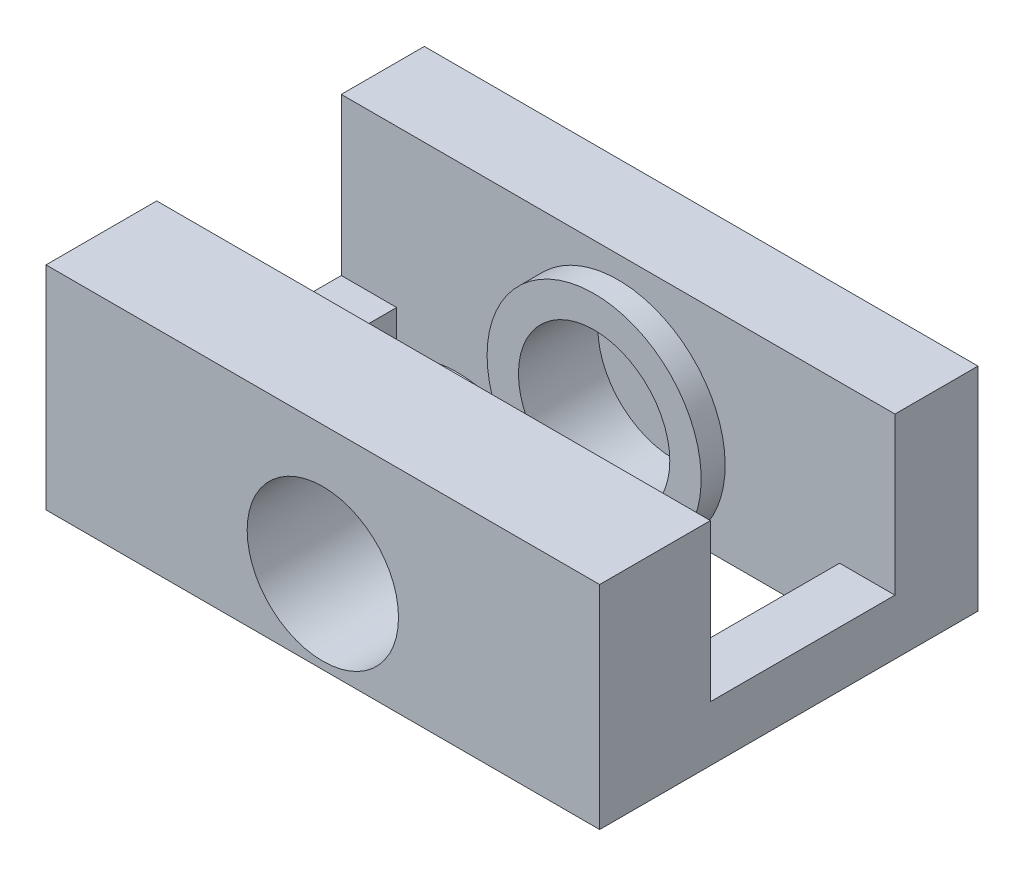
ISO-10303-21;
HEADER;
FILE_DESCRIPTION(('STEP AP214'),'2;1');
FILE_NAME('part.step','',(''),(''),'','','');
FILE_SCHEMA(('AUTOMOTIVE_DESIGN { 1 0 10303 214 1 1 1 1 }'));
ENDSEC;
DATA;
#1=APPLICATION_CONTEXT('core data for automotive mechanical design processes');
#2=APPLICATION_PROTOCOL_DEFINITION('international standard','automotive_design',2000,#1);
#3=PRODUCT_CONTEXT('',#1,'mechanical');
#4=PRODUCT('Part','Part','',(#3));
#5=PRODUCT_RELATED_PRODUCT_CATEGORY('part','',(#4));
#6=PRODUCT_DEFINITION_FORMATION('','',#4);
#7=PRODUCT_DEFINITION_CONTEXT('part definition',#1,'design');
#8=PRODUCT_DEFINITION('design','',#6,#7);
#9=PRODUCT_DEFINITION_SHAPE('','',#8);
#10=(LENGTH_UNIT() NAMED_UNIT(*) SI_UNIT(.MILLI.,.METRE.));
#11=(NAMED_UNIT(*) PLANE_ANGLE_UNIT() SI_UNIT($,.RADIAN.));
#12=(NAMED_UNIT(*) SI_UNIT($,.STERADIAN.) SOLID_ANGLE_UNIT());
#13=UNCERTAINTY_MEASURE_WITH_UNIT(LENGTH_MEASURE(1.E-05),#10,'distance_accuracy_value','');
#14=(GEOMETRIC_REPRESENTATION_CONTEXT(3) GLOBAL_UNCERTAINTY_ASSIGNED_CONTEXT((#13)) GLOBAL_UNIT_ASSIGNED_CONTEXT((#10,
#11,#12)) REPRESENTATION_CONTEXT('',''));
#15=CARTESIAN_POINT('',(0.,0.,0.));
#16=DIRECTION('',(0.,0.,1.));
#17=DIRECTION('',(1.,0.,0.));
#18=AXIS2_PLACEMENT_3D('',#15,#16,#17);
#19=CARTESIAN_POINT('',(85.,9.5,-163.));
#20=DIRECTION('',(0.,0.,-1.));
#21=DIRECTION('',(0.,-1.,0.));
#22=AXIS2_PLACEMENT_3D('',#19,#20,#21);
#23=PLANE('',#22);
#24=CARTESIAN_POINT('',(85.,9.5,-163.));
#25=DIRECTION('',(0.,0.,-1.));
#26=DIRECTION('',(-1.,0.,0.));
#27=AXIS2_PLACEMENT_3D('',#24,#25,#26);
#28=CIRCLE('',#27,4.1);
#29=CARTESIAN_POINT('',(80.9,9.5,-163.));
#30=VERTEX_POINT('',#29);
#31=EDGE_CURVE('E11',#30,#30,#28,.T.);
#32=ORIENTED_EDGE('',*,*,#31,.F.);
#33=EDGE_LOOP('',(#32));
#34=FACE_BOUND('',#33,.T.);
#35=ADVANCED_FACE('F17',(#34),#23,.F.);
#36=CARTESIAN_POINT('',(85.,9.5,-143.));
#37=DIRECTION('',(0.,0.,1.));
#38=DIRECTION('',(-1.,0.,0.));
#39=AXIS2_PLACEMENT_3D('',#36,#37,#38);
#40=CYLINDRICAL_SURFACE('',#39,4.1);
#41=CARTESIAN_POINT('',(85.,9.5,-158.7));
#42=DIRECTION('',(0.,0.,1.));
#43=DIRECTION('',(-1.,0.,0.));
#44=AXIS2_PLACEMENT_3D('',#41,#42,#43);
#45=CIRCLE('',#44,4.1);
#46=CARTESIAN_POINT('',(80.9,9.5,-158.7));
#47=VERTEX_POINT('',#46);
#48=EDGE_CURVE('E139',#47,#47,#45,.T.);
#49=ORIENTED_EDGE('',*,*,#48,.T.);
#50=DIRECTION('',(0.,0.,-1.));
#51=VECTOR('',#50,1.);
#52=CARTESIAN_POINT('',(80.9,9.5,-143.));
#53=LINE('',#52,#51);
#54=EDGE_CURVE('E27',#47,#30,#53,.T.);
#55=ORIENTED_EDGE('',*,*,#54,.T.);
#56=ORIENTED_EDGE('',*,*,#31,.T.);
#57=ORIENTED_EDGE('',*,*,#54,.F.);
#58=EDGE_LOOP('',(#49,#55,#56,#57));
#59=FACE_BOUND('',#58,.T.);
#60=ADVANCED_FACE('F264',(#59),#40,.F.);
#61=CARTESIAN_POINT('',(85.,9.5,-158.7));
#62=DIRECTION('',(0.,0.,-1.));
#63=DIRECTION('',(0.,-1.,0.));
#64=AXIS2_PLACEMENT_3D('',#61,#62,#63);
#65=PLANE('',#64);
#66=ORIENTED_EDGE('',*,*,#48,.F.);
#67=EDGE_LOOP('',(#66));
#68=FACE_BOUND('',#67,.T.);
#69=CARTESIAN_POINT('',(85.,9.5,-158.7));
#70=DIRECTION('',(0.,0.,-1.));
#71=DIRECTION('',(-1.,0.,0.));
#72=AXIS2_PLACEMENT_3D('',#69,#70,#71);
#73=CIRCLE('',#72,5.8);
#74=CARTESIAN_POINT('',(79.2,9.5,-158.7));
#75=VERTEX_POINT('',#74);
#76=EDGE_CURVE('E131',#75,#75,#73,.T.);
#77=ORIENTED_EDGE('',*,*,#76,.F.);
#78=EDGE_LOOP('',(#77));
#79=FACE_BOUND('',#78,.T.);
#80=ADVANCED_FACE('F268',(#68,#79),#65,.F.);
#81=CARTESIAN_POINT('',(85.,9.5,-151.3));
#82=DIRECTION('',(0.,0.,-1.));
#83=DIRECTION('',(0.,-1.,0.));
#84=AXIS2_PLACEMENT_3D('',#81,#82,#83);
#85=PLANE('',#84);
#86=CARTESIAN_POINT('',(85.,9.5,-151.3));
#87=DIRECTION('',(0.,0.,1.));
#88=DIRECTION('',(-1.,0.,0.));
#89=AXIS2_PLACEMENT_3D('',#86,#87,#88);
#90=CIRCLE('',#89,4.1);
#91=CARTESIAN_POINT('',(80.9,9.5,-151.3));
#92=VERTEX_POINT('',#91);
#93=EDGE_CURVE('E261',#92,#92,#90,.T.);
#94=ORIENTED_EDGE('',*,*,#93,.T.);
#95=EDGE_LOOP('',(#94));
#96=FACE_BOUND('',#95,.T.);
#97=CARTESIAN_POINT('',(85.,9.5,-151.3));
#98=DIRECTION('',(0.,0.,-1.));
#99=DIRECTION('',(-1.,0.,0.));
#100=AXIS2_PLACEMENT_3D('',#97,#98,#99);
#101=CIRCLE('',#100,5.8);
#102=CARTESIAN_POINT('',(79.2,9.5,-151.3));
#103=VERTEX_POINT('',#102);
#104=EDGE_CURVE('E150',#103,#103,#101,.T.);
#105=ORIENTED_EDGE('',*,*,#104,.T.);
#106=EDGE_LOOP('',(#105));
#107=FACE_BOUND('',#106,.T.);
#108=ADVANCED_FACE('F269',(#96,#107),#85,.T.);
#109=CARTESIAN_POINT('',(85.,9.5,-160.));
#110=DIRECTION('',(0.,0.,-1.));
#111=DIRECTION('',(-1.,0.,0.));
#112=AXIS2_PLACEMENT_3D('',#109,#110,#111);
#113=CYLINDRICAL_SURFACE('',#112,5.8);
#114=CARTESIAN_POINT('',(85.,9.5,-160.));
#115=DIRECTION('',(0.,0.,-1.));
#116=DIRECTION('',(-1.,0.,0.));
#117=AXIS2_PLACEMENT_3D('',#114,#115,#116);
#118=CIRCLE('',#117,5.8);
#119=CARTESIAN_POINT('',(79.2,9.5,-160.));
#120=VERTEX_POINT('',#119);
#121=CARTESIAN_POINT('',(88.659234892706,5.,-160.));
#122=VERTEX_POINT('',#121);
#123=EDGE_CURVE('E216',#120,#122,#118,.T.);
#124=ORIENTED_EDGE('',*,*,#123,.F.);
#125=DIRECTION('',(0.,0.,1.));
#126=VECTOR('',#125,1.);
#127=CARTESIAN_POINT('',(79.2,9.5,-160.));
#128=LINE('',#127,#126);
#129=EDGE_CURVE('E134',#120,#75,#128,.T.);
#130=ORIENTED_EDGE('',*,*,#129,.T.);
#131=ORIENTED_EDGE('',*,*,#76,.T.);
#132=ORIENTED_EDGE('',*,*,#129,.F.);
#133=CARTESIAN_POINT('',(85.,9.5,-160.));
#134=DIRECTION('',(0.,0.,-1.));
#135=DIRECTION('',(-1.,0.,0.));
#136=AXIS2_PLACEMENT_3D('',#133,#134,#135);
#137=CIRCLE('',#136,5.8);
#138=CARTESIAN_POINT('',(81.340765107294,5.,-160.));
#139=VERTEX_POINT('',#138);
#140=EDGE_CURVE('E215',#139,#120,#137,.T.);
#141=ORIENTED_EDGE('',*,*,#140,.F.);
#142=CARTESIAN_POINT('',(85.,9.5,-160.));
#143=DIRECTION('',(0.,0.,-1.));
#144=DIRECTION('',(-1.,0.,0.));
#145=AXIS2_PLACEMENT_3D('',#142,#143,#144);
#146=CIRCLE('',#145,5.8);
#147=EDGE_CURVE('E249',#122,#139,#146,.T.);
#148=ORIENTED_EDGE('',*,*,#147,.F.);
#149=EDGE_LOOP('',(#124,#130,#131,#132,#141,#148));
#150=FACE_BOUND('',#149,.T.);
#151=ADVANCED_FACE('F132',(#150),#113,.T.);
#152=CARTESIAN_POINT('',(71.5,8.,-154.25));
#153=DIRECTION('',(0.,1.,0.));
#154=DIRECTION('',(0.,0.,-1.));
#155=AXIS2_PLACEMENT_3D('',#152,#153,#154);
#156=PLANE('',#155);
#157=DIRECTION('',(-1.,0.,0.));
#158=VECTOR('',#157,1.);
#159=CARTESIAN_POINT('',(85.75,8.,-150.));
#160=LINE('',#159,#158);
#161=CARTESIAN_POINT('',(73.,8.,-150.));
#162=VERTEX_POINT('',#161);
#163=CARTESIAN_POINT('',(70.,8.,-150.));
#164=VERTEX_POINT('',#163);
#165=EDGE_CURVE('E186',#162,#164,#160,.T.);
#166=ORIENTED_EDGE('',*,*,#165,.F.);
#167=DIRECTION('',(0.,0.,-1.));
#168=VECTOR('',#167,1.);
#169=CARTESIAN_POINT('',(73.,8.,-144.));
#170=LINE('',#169,#168);
#171=CARTESIAN_POINT('',(73.,8.,-160.));
#172=VERTEX_POINT('',#171);
#173=EDGE_CURVE('E255',#162,#172,#170,.T.);
#174=ORIENTED_EDGE('',*,*,#173,.T.);
#175=DIRECTION('',(1.,0.,0.));
#176=VECTOR('',#175,1.);
#177=CARTESIAN_POINT('',(70.75,8.,-160.));
#178=LINE('',#177,#176);
#179=CARTESIAN_POINT('',(70.,8.,-160.));
#180=VERTEX_POINT('',#179);
#181=EDGE_CURVE('E231',#180,#172,#178,.T.);
#182=ORIENTED_EDGE('',*,*,#181,.F.);
#183=DIRECTION('',(0.,0.,1.));
#184=VECTOR('',#183,1.);
#185=CARTESIAN_POINT('',(70.,8.,-164.5));
#186=LINE('',#185,#184);
#187=EDGE_CURVE('E243',#180,#164,#186,.T.);
#188=ORIENTED_EDGE('',*,*,#187,.T.);
#189=EDGE_LOOP('',(#166,#174,#182,#188));
#190=FACE_BOUND('',#189,.T.);
#191=ADVANCED_FACE('F311',(#190),#156,.T.);
#192=CARTESIAN_POINT('',(85.,9.5,-150.));
#193=DIRECTION('',(0.,0.,1.));
#194=DIRECTION('',(-1.,0.,0.));
#195=AXIS2_PLACEMENT_3D('',#192,#193,#194);
#196=CYLINDRICAL_SURFACE('',#195,5.8);
#197=CARTESIAN_POINT('',(85.,9.5,-150.));
#198=DIRECTION('',(0.,0.,-1.));
#199=DIRECTION('',(-1.,0.,0.));
#200=AXIS2_PLACEMENT_3D('',#197,#198,#199);
#201=CIRCLE('',#200,5.8);
#202=CARTESIAN_POINT('',(88.659234892706,5.,-150.));
#203=VERTEX_POINT('',#202);
#204=CARTESIAN_POINT('',(81.340765107294,5.,-150.));
#205=VERTEX_POINT('',#204);
#206=EDGE_CURVE('E253',#203,#205,#201,.T.);
#207=ORIENTED_EDGE('',*,*,#206,.T.);
#208=CARTESIAN_POINT('',(85.,9.5,-150.));
#209=DIRECTION('',(0.,0.,-1.));
#210=DIRECTION('',(-1.,0.,0.));
#211=AXIS2_PLACEMENT_3D('',#208,#209,#210);
#212=CIRCLE('',#211,5.8);
#213=CARTESIAN_POINT('',(79.2,9.5,-150.));
#214=VERTEX_POINT('',#213);
#215=EDGE_CURVE('E178',#205,#214,#212,.T.);
#216=ORIENTED_EDGE('',*,*,#215,.T.);
#217=DIRECTION('',(0.,0.,-1.));
#218=VECTOR('',#217,1.);
#219=CARTESIAN_POINT('',(79.2,9.5,-150.));
#220=LINE('',#219,#218);
#221=EDGE_CURVE('E173',#214,#103,#220,.T.);
#222=ORIENTED_EDGE('',*,*,#221,.T.);
#223=ORIENTED_EDGE('',*,*,#104,.F.);
#224=ORIENTED_EDGE('',*,*,#221,.F.);
#225=CARTESIAN_POINT('',(85.,9.5,-150.));
#226=DIRECTION('',(0.,0.,-1.));
#227=DIRECTION('',(-1.,0.,0.));
#228=AXIS2_PLACEMENT_3D('',#225,#226,#227);
#229=CIRCLE('',#228,5.8);
#230=EDGE_CURVE('E171',#214,#203,#229,.T.);
#231=ORIENTED_EDGE('',*,*,#230,.T.);
#232=EDGE_LOOP('',(#207,#216,#222,#223,#224,#231));
#233=FACE_BOUND('',#232,.T.);
#234=ADVANCED_FACE('F325',(#233),#196,.T.);
#235=CARTESIAN_POINT('',(85.,9.5,-143.));
#236=DIRECTION('',(0.,0.,1.));
#237=DIRECTION('',(-1.,0.,0.));
#238=AXIS2_PLACEMENT_3D('',#235,#236,#237);
#239=CYLINDRICAL_SURFACE('',#238,4.1);
#240=CARTESIAN_POINT('',(85.,9.5,-144.));
#241=DIRECTION('',(0.,0.,1.));
#242=DIRECTION('',(-1.,0.,0.));
#243=AXIS2_PLACEMENT_3D('',#240,#241,#242);
#244=CIRCLE('',#243,4.1);
#245=CARTESIAN_POINT('',(80.9,9.5,-144.));
#246=VERTEX_POINT('',#245);
#247=EDGE_CURVE('E159',#246,#246,#244,.T.);
#248=ORIENTED_EDGE('',*,*,#247,.T.);
#249=DIRECTION('',(0.,0.,-1.));
#250=VECTOR('',#249,1.);
#251=CARTESIAN_POINT('',(80.9,9.5,-143.));
#252=LINE('',#251,#250);
#253=EDGE_CURVE('E260',#246,#92,#252,.T.);
#254=ORIENTED_EDGE('',*,*,#253,.T.);
#255=ORIENTED_EDGE('',*,*,#93,.F.);
#256=ORIENTED_EDGE('',*,*,#253,.F.);
#257=EDGE_LOOP('',(#248,#254,#255,#256));
#258=FACE_BOUND('',#257,.T.);
#259=ADVANCED_FACE('F334',(#258),#239,.F.);
#260=CARTESIAN_POINT('',(73.,5.,-144.));
#261=DIRECTION('',(-1.,0.,0.));
#262=DIRECTION('',(0.,0.,1.));
#263=AXIS2_PLACEMENT_3D('',#260,#261,#262);
#264=PLANE('',#263);
#265=DIRECTION('',(0.,1.,0.));
#266=VECTOR('',#265,1.);
#267=CARTESIAN_POINT('',(73.,5.,-160.));
#268=LINE('',#267,#266);
#269=CARTESIAN_POINT('',(73.,5.,-160.));
#270=VERTEX_POINT('',#269);
#271=EDGE_CURVE('E208',#270,#172,#268,.T.);
#272=ORIENTED_EDGE('',*,*,#271,.T.);
#273=ORIENTED_EDGE('',*,*,#173,.F.);
#274=DIRECTION('',(0.,-1.,0.));
#275=VECTOR('',#274,1.);
#276=CARTESIAN_POINT('',(73.,5.,-150.));
#277=LINE('',#276,#275);
#278=CARTESIAN_POINT('',(73.,5.,-150.));
#279=VERTEX_POINT('',#278);
#280=EDGE_CURVE('E181',#162,#279,#277,.T.);
#281=ORIENTED_EDGE('',*,*,#280,.T.);
#282=DIRECTION('',(0.,0.,-1.));
#283=VECTOR('',#282,1.);
#284=CARTESIAN_POINT('',(73.,5.,-144.));
#285=LINE('',#284,#283);
#286=EDGE_CURVE('E543',#279,#270,#285,.T.);
#287=ORIENTED_EDGE('',*,*,#286,.T.);
#288=EDGE_LOOP('',(#272,#273,#281,#287));
#289=FACE_BOUND('',#288,.T.);
#290=ADVANCED_FACE('F342',(#289),#264,.F.);
#291=CARTESIAN_POINT('',(85.,9.5,-150.));
#292=DIRECTION('',(0.,0.,-1.));
#293=DIRECTION('',(0.,-1.,0.));
#294=AXIS2_PLACEMENT_3D('',#291,#292,#293);
#295=PLANE('',#294);
#296=ORIENTED_EDGE('',*,*,#206,.F.);
#297=DIRECTION('',(-1.,0.,0.));
#298=VECTOR('',#297,1.);
#299=CARTESIAN_POINT('',(100.,5.,-150.));
#300=LINE('',#299,#298);
#301=EDGE_CURVE('E545',#203,#205,#300,.T.);
#302=ORIENTED_EDGE('',*,*,#301,.T.);
#303=EDGE_LOOP('',(#296,#302));
#304=FACE_BOUND('',#303,.T.);
#305=ADVANCED_FACE('F353',(#304),#295,.F.);
#306=CARTESIAN_POINT('',(97.,5.,-164.5));
#307=DIRECTION('',(1.,0.,0.));
#308=DIRECTION('',(0.,0.,1.));
#309=AXIS2_PLACEMENT_3D('',#306,#307,#308);
#310=PLANE('',#309);
#311=DIRECTION('',(0.,1.,0.));
#312=VECTOR('',#311,1.);
#313=CARTESIAN_POINT('',(97.,5.,-150.));
#314=LINE('',#313,#312);
#315=CARTESIAN_POINT('',(97.,5.,-150.));
#316=VERTEX_POINT('',#315);
#317=CARTESIAN_POINT('',(97.,8.,-150.));
#318=VERTEX_POINT('',#317);
#319=EDGE_CURVE('E197',#316,#318,#314,.T.);
#320=ORIENTED_EDGE('',*,*,#319,.T.);
#321=DIRECTION('',(0.,0.,1.));
#322=VECTOR('',#321,1.);
#323=CARTESIAN_POINT('',(97.,8.,-164.5));
#324=LINE('',#323,#322);
#325=CARTESIAN_POINT('',(97.,8.,-160.));
#326=VERTEX_POINT('',#325);
#327=EDGE_CURVE('E202',#326,#318,#324,.T.);
#328=ORIENTED_EDGE('',*,*,#327,.F.);
#329=DIRECTION('',(0.,-1.,0.));
#330=VECTOR('',#329,1.);
#331=CARTESIAN_POINT('',(97.,5.,-160.));
#332=LINE('',#331,#330);
#333=CARTESIAN_POINT('',(97.,5.,-160.));
#334=VERTEX_POINT('',#333);
#335=EDGE_CURVE('E219',#326,#334,#332,.T.);
#336=ORIENTED_EDGE('',*,*,#335,.T.);
#337=DIRECTION('',(0.,0.,1.));
#338=VECTOR('',#337,1.);
#339=CARTESIAN_POINT('',(97.,5.,-164.5));
#340=LINE('',#339,#338);
#341=EDGE_CURVE('E565',#334,#316,#340,.T.);
#342=ORIENTED_EDGE('',*,*,#341,.T.);
#343=EDGE_LOOP('',(#320,#328,#336,#342));
#344=FACE_BOUND('',#343,.T.);
#345=ADVANCED_FACE('F365',(#344),#310,.F.);
#346=CARTESIAN_POINT('',(85.,9.5,-160.));
#347=DIRECTION('',(0.,0.,-1.));
#348=DIRECTION('',(0.,-1.,0.));
#349=AXIS2_PLACEMENT_3D('',#346,#347,#348);
#350=PLANE('',#349);
#351=DIRECTION('',(1.,0.,0.));
#352=VECTOR('',#351,1.);
#353=CARTESIAN_POINT('',(70.,5.,-160.));
#354=LINE('',#353,#352);
#355=EDGE_CURVE('E567',#139,#122,#354,.T.);
#356=ORIENTED_EDGE('',*,*,#355,.T.);
#357=ORIENTED_EDGE('',*,*,#147,.T.);
#358=EDGE_LOOP('',(#356,#357));
#359=FACE_BOUND('',#358,.T.);
#360=ADVANCED_FACE('F372',(#359),#350,.T.);
#361=CARTESIAN_POINT('',(70.,5.,-150.));
#362=DIRECTION('',(1.,0.,0.));
#363=DIRECTION('',(0.,0.,1.));
#364=AXIS2_PLACEMENT_3D('',#361,#362,#363);
#365=PLANE('',#364);
#366=DIRECTION('',(0.,0.,1.));
#367=VECTOR('',#366,1.);
#368=CARTESIAN_POINT('',(70.,16.5,-150.));
#369=LINE('',#368,#367);
#370=CARTESIAN_POINT('',(70.,16.5,-150.));
#371=VERTEX_POINT('',#370);
#372=CARTESIAN_POINT('',(70.,16.5,-144.));
#373=VERTEX_POINT('',#372);
#374=EDGE_CURVE('E169',#371,#373,#369,.T.);
#375=ORIENTED_EDGE('',*,*,#374,.F.);
#376=DIRECTION('',(0.,1.,0.));
#377=VECTOR('',#376,1.);
#378=CARTESIAN_POINT('',(70.,5.,-150.));
#379=LINE('',#378,#377);
#380=EDGE_CURVE('E189',#164,#371,#379,.T.);
#381=ORIENTED_EDGE('',*,*,#380,.F.);
#382=ORIENTED_EDGE('',*,*,#187,.F.);
#383=DIRECTION('',(0.,1.,0.));
#384=VECTOR('',#383,1.);
#385=CARTESIAN_POINT('',(70.,5.,-160.));
#386=LINE('',#385,#384);
#387=CARTESIAN_POINT('',(70.,16.5,-160.));
#388=VERTEX_POINT('',#387);
#389=EDGE_CURVE('E227',#180,#388,#386,.T.);
#390=ORIENTED_EDGE('',*,*,#389,.T.);
#391=DIRECTION('',(0.,0.,1.));
#392=VECTOR('',#391,1.);
#393=CARTESIAN_POINT('',(70.,16.5,-164.5));
#394=LINE('',#393,#392);
#395=CARTESIAN_POINT('',(70.,16.5,-164.5));
#396=VERTEX_POINT('',#395);
#397=EDGE_CURVE('E237',#396,#388,#394,.T.);
#398=ORIENTED_EDGE('',*,*,#397,.F.);
#399=DIRECTION('',(0.,-1.,0.));
#400=VECTOR('',#399,1.);
#401=CARTESIAN_POINT('',(70.,16.5,-164.5));
#402=LINE('',#401,#400);
#403=CARTESIAN_POINT('',(70.,5.,-164.5));
#404=VERTEX_POINT('',#403);
#405=EDGE_CURVE('E241',#396,#404,#402,.T.);
#406=ORIENTED_EDGE('',*,*,#405,.T.);
#407=DIRECTION('',(0.,0.,-1.));
#408=VECTOR('',#407,1.);
#409=CARTESIAN_POINT('',(70.,5.,-144.));
#410=LINE('',#409,#408);
#411=CARTESIAN_POINT('',(70.,5.,-144.));
#412=VERTEX_POINT('',#411);
#413=EDGE_CURVE('E534',#412,#404,#410,.T.);
#414=ORIENTED_EDGE('',*,*,#413,.F.);
#415=DIRECTION('',(0.,-1.,0.));
#416=VECTOR('',#415,1.);
#417=CARTESIAN_POINT('',(70.,16.5,-144.));
#418=LINE('',#417,#416);
#419=EDGE_CURVE('E156',#373,#412,#418,.T.);
#420=ORIENTED_EDGE('',*,*,#419,.F.);
#421=EDGE_LOOP('',(#375,#381,#382,#390,#398,#406,#414,#420));
#422=FACE_BOUND('',#421,.T.);
#423=ADVANCED_FACE('F383',(#422),#365,.F.);
#424=CARTESIAN_POINT('',(100.,5.,-164.5));
#425=DIRECTION('',(0.,0.,1.));
#426=DIRECTION('',(1.,0.,0.));
#427=AXIS2_PLACEMENT_3D('',#424,#425,#426);
#428=PLANE('',#427);
#429=DIRECTION('',(-1.,0.,0.));
#430=VECTOR('',#429,1.);
#431=CARTESIAN_POINT('',(100.,16.5,-164.5));
#432=LINE('',#431,#430);
#433=CARTESIAN_POINT('',(100.,16.5,-164.5));
#434=VERTEX_POINT('',#433);
#435=EDGE_CURVE('E234',#434,#396,#432,.T.);
#436=ORIENTED_EDGE('',*,*,#435,.F.);
#437=DIRECTION('',(0.,1.,0.));
#438=VECTOR('',#437,1.);
#439=CARTESIAN_POINT('',(100.,5.,-164.5));
#440=LINE('',#439,#438);
#441=CARTESIAN_POINT('',(100.,5.,-164.5));
#442=VERTEX_POINT('',#441);
#443=EDGE_CURVE('E492',#442,#434,#440,.T.);
#444=ORIENTED_EDGE('',*,*,#443,.F.);
#445=DIRECTION('',(1.,0.,0.));
#446=VECTOR('',#445,1.);
#447=CARTESIAN_POINT('',(70.,5.,-164.5));
#448=LINE('',#447,#446);
#449=EDGE_CURVE('E530',#404,#442,#448,.T.);
#450=ORIENTED_EDGE('',*,*,#449,.F.);
#451=ORIENTED_EDGE('',*,*,#405,.F.);
#452=EDGE_LOOP('',(#436,#444,#450,#451));
#453=FACE_BOUND('',#452,.T.);
#454=ADVANCED_FACE('F393',(#453),#428,.F.);
#455=CARTESIAN_POINT('',(85.,16.5,-162.25));
#456=DIRECTION('',(0.,1.,0.));
#457=DIRECTION('',(0.,0.,-1.));
#458=AXIS2_PLACEMENT_3D('',#455,#456,#457);
#459=PLANE('',#458);
#460=DIRECTION('',(0.,0.,-1.));
#461=VECTOR('',#460,1.);
#462=CARTESIAN_POINT('',(100.,16.5,-160.));
#463=LINE('',#462,#461);
#464=CARTESIAN_POINT('',(100.,16.5,-160.));
#465=VERTEX_POINT('',#464);
#466=EDGE_CURVE('E500',#465,#434,#463,.T.);
#467=ORIENTED_EDGE('',*,*,#466,.T.);
#468=ORIENTED_EDGE('',*,*,#435,.T.);
#469=ORIENTED_EDGE('',*,*,#397,.T.);
#470=DIRECTION('',(1.,0.,0.));
#471=VECTOR('',#470,1.);
#472=CARTESIAN_POINT('',(70.,16.5,-160.));
#473=LINE('',#472,#471);
#474=EDGE_CURVE('E224',#388,#465,#473,.T.);
#475=ORIENTED_EDGE('',*,*,#474,.T.);
#476=EDGE_LOOP('',(#467,#468,#469,#475));
#477=FACE_BOUND('',#476,.T.);
#478=ADVANCED_FACE('F404',(#477),#459,.T.);
#479=CARTESIAN_POINT('',(70.,5.,-160.));
#480=DIRECTION('',(0.,0.,-1.));
#481=DIRECTION('',(0.,-1.,0.));
#482=AXIS2_PLACEMENT_3D('',#479,#480,#481);
#483=PLANE('',#482);
#484=ORIENTED_EDGE('',*,*,#271,.F.);
#485=DIRECTION('',(1.,0.,0.));
#486=VECTOR('',#485,1.);
#487=CARTESIAN_POINT('',(70.,5.,-160.));
#488=LINE('',#487,#486);
#489=EDGE_CURVE('E151',#270,#139,#488,.T.);
#490=ORIENTED_EDGE('',*,*,#489,.T.);
#491=ORIENTED_EDGE('',*,*,#140,.T.);
#492=ORIENTED_EDGE('',*,*,#123,.T.);
#493=DIRECTION('',(1.,0.,0.));
#494=VECTOR('',#493,1.);
#495=CARTESIAN_POINT('',(70.,5.,-160.));
#496=LINE('',#495,#494);
#497=EDGE_CURVE('E570',#122,#334,#496,.T.);
#498=ORIENTED_EDGE('',*,*,#497,.T.);
#499=ORIENTED_EDGE('',*,*,#335,.F.);
#500=DIRECTION('',(1.,0.,0.));
#501=VECTOR('',#500,1.);
#502=CARTESIAN_POINT('',(84.25,8.,-160.));
#503=LINE('',#502,#501);
#504=CARTESIAN_POINT('',(100.,8.,-160.));
#505=VERTEX_POINT('',#504);
#506=EDGE_CURVE('E203',#326,#505,#503,.T.);
#507=ORIENTED_EDGE('',*,*,#506,.T.);
#508=DIRECTION('',(0.,1.,0.));
#509=VECTOR('',#508,1.);
#510=CARTESIAN_POINT('',(100.,5.,-160.));
#511=LINE('',#510,#509);
#512=EDGE_CURVE('E511',#505,#465,#511,.T.);
#513=ORIENTED_EDGE('',*,*,#512,.T.);
#514=ORIENTED_EDGE('',*,*,#474,.F.);
#515=ORIENTED_EDGE('',*,*,#389,.F.);
#516=ORIENTED_EDGE('',*,*,#181,.T.);
#517=EDGE_LOOP('',(#484,#490,#491,#492,#498,#499,#507,#513,#514,#515,#516));
#518=FACE_BOUND('',#517,.T.);
#519=ADVANCED_FACE('F413',(#518),#483,.F.);
#520=CARTESIAN_POINT('',(98.5,8.,-154.25));
#521=DIRECTION('',(0.,1.,0.));
#522=DIRECTION('',(0.,0.,-1.));
#523=AXIS2_PLACEMENT_3D('',#520,#521,#522);
#524=PLANE('',#523);
#525=DIRECTION('',(-1.,0.,0.));
#526=VECTOR('',#525,1.);
#527=CARTESIAN_POINT('',(99.25,8.,-150.));
#528=LINE('',#527,#526);
#529=CARTESIAN_POINT('',(100.,8.,-150.));
#530=VERTEX_POINT('',#529);
#531=EDGE_CURVE('E194',#530,#318,#528,.T.);
#532=ORIENTED_EDGE('',*,*,#531,.F.);
#533=DIRECTION('',(0.,0.,-1.));
#534=VECTOR('',#533,1.);
#535=CARTESIAN_POINT('',(100.,8.,-144.));
#536=LINE('',#535,#534);
#537=EDGE_CURVE('E523',#530,#505,#536,.T.);
#538=ORIENTED_EDGE('',*,*,#537,.T.);
#539=ORIENTED_EDGE('',*,*,#506,.F.);
#540=ORIENTED_EDGE('',*,*,#327,.T.);
#541=EDGE_LOOP('',(#532,#538,#539,#540));
#542=FACE_BOUND('',#541,.T.);
#543=ADVANCED_FACE('F424',(#542),#524,.T.);
#544=CARTESIAN_POINT('',(100.,5.,-150.));
#545=DIRECTION('',(0.,0.,1.));
#546=DIRECTION('',(1.,0.,0.));
#547=AXIS2_PLACEMENT_3D('',#544,#545,#546);
#548=PLANE('',#547);
#549=ORIENTED_EDGE('',*,*,#230,.F.);
#550=ORIENTED_EDGE('',*,*,#215,.F.);
#551=DIRECTION('',(-1.,0.,0.));
#552=VECTOR('',#551,1.);
#553=CARTESIAN_POINT('',(100.,5.,-150.));
#554=LINE('',#553,#552);
#555=EDGE_CURVE('E538',#205,#279,#554,.T.);
#556=ORIENTED_EDGE('',*,*,#555,.T.);
#557=ORIENTED_EDGE('',*,*,#280,.F.);
#558=ORIENTED_EDGE('',*,*,#165,.T.);
#559=ORIENTED_EDGE('',*,*,#380,.T.);
#560=DIRECTION('',(-1.,0.,0.));
#561=VECTOR('',#560,1.);
#562=CARTESIAN_POINT('',(100.,16.5,-150.));
#563=LINE('',#562,#561);
#564=CARTESIAN_POINT('',(100.,16.5,-150.));
#565=VERTEX_POINT('',#564);
#566=EDGE_CURVE('E163',#565,#371,#563,.T.);
#567=ORIENTED_EDGE('',*,*,#566,.F.);
#568=DIRECTION('',(0.,1.,0.));
#569=VECTOR('',#568,1.);
#570=CARTESIAN_POINT('',(100.,5.,-150.));
#571=LINE('',#570,#569);
#572=EDGE_CURVE('E519',#530,#565,#571,.T.);
#573=ORIENTED_EDGE('',*,*,#572,.F.);
#574=ORIENTED_EDGE('',*,*,#531,.T.);
#575=ORIENTED_EDGE('',*,*,#319,.F.);
#576=DIRECTION('',(-1.,0.,0.));
#577=VECTOR('',#576,1.);
#578=CARTESIAN_POINT('',(100.,5.,-150.));
#579=LINE('',#578,#577);
#580=EDGE_CURVE('E555',#316,#203,#579,.T.);
#581=ORIENTED_EDGE('',*,*,#580,.T.);
#582=EDGE_LOOP('',(#549,#550,#556,#557,#558,#559,#567,#573,#574,#575,#581));
#583=FACE_BOUND('',#582,.T.);
#584=ADVANCED_FACE('F433',(#583),#548,.F.);
#585=CARTESIAN_POINT('',(85.,16.5,-147.));
#586=DIRECTION('',(0.,1.,0.));
#587=DIRECTION('',(0.,0.,-1.));
#588=AXIS2_PLACEMENT_3D('',#585,#586,#587);
#589=PLANE('',#588);
#590=DIRECTION('',(0.,0.,-1.));
#591=VECTOR('',#590,1.);
#592=CARTESIAN_POINT('',(100.,16.5,-144.));
#593=LINE('',#592,#591);
#594=CARTESIAN_POINT('',(100.,16.5,-144.));
#595=VERTEX_POINT('',#594);
#596=EDGE_CURVE('E517',#595,#565,#593,.T.);
#597=ORIENTED_EDGE('',*,*,#596,.T.);
#598=ORIENTED_EDGE('',*,*,#566,.T.);
#599=ORIENTED_EDGE('',*,*,#374,.T.);
#600=DIRECTION('',(1.,0.,0.));
#601=VECTOR('',#600,1.);
#602=CARTESIAN_POINT('',(70.,16.5,-144.));
#603=LINE('',#602,#601);
#604=EDGE_CURVE('E153',#373,#595,#603,.T.);
#605=ORIENTED_EDGE('',*,*,#604,.T.);
#606=EDGE_LOOP('',(#597,#598,#599,#605));
#607=FACE_BOUND('',#606,.T.);
#608=ADVANCED_FACE('F445',(#607),#589,.T.);
#609=CARTESIAN_POINT('',(70.,5.,-144.));
#610=DIRECTION('',(0.,0.,-1.));
#611=DIRECTION('',(0.,-1.,0.));
#612=AXIS2_PLACEMENT_3D('',#609,#610,#611);
#613=PLANE('',#612);
#614=ORIENTED_EDGE('',*,*,#247,.F.);
#615=EDGE_LOOP('',(#614));
#616=FACE_BOUND('',#615,.T.);
#617=DIRECTION('',(0.,-1.,0.));
#618=VECTOR('',#617,1.);
#619=CARTESIAN_POINT('',(100.,16.5,-144.));
#620=LINE('',#619,#618);
#621=CARTESIAN_POINT('',(100.,5.,-144.));
#622=VERTEX_POINT('',#621);
#623=EDGE_CURVE('E516',#595,#622,#620,.T.);
#624=ORIENTED_EDGE('',*,*,#623,.F.);
#625=ORIENTED_EDGE('',*,*,#604,.F.);
#626=ORIENTED_EDGE('',*,*,#419,.T.);
#627=DIRECTION('',(-1.,0.,0.));
#628=VECTOR('',#627,1.);
#629=CARTESIAN_POINT('',(100.,5.,-144.));
#630=LINE('',#629,#628);
#631=EDGE_CURVE('E531',#622,#412,#630,.T.);
#632=ORIENTED_EDGE('',*,*,#631,.F.);
#633=EDGE_LOOP('',(#624,#625,#626,#632));
#634=FACE_BOUND('',#633,.T.);
#635=ADVANCED_FACE('F455',(#616,#634),#613,.F.);
#636=CARTESIAN_POINT('',(85.,5.,-147.));
#637=DIRECTION('',(0.,1.,0.));
#638=DIRECTION('',(0.,0.,-1.));
#639=AXIS2_PLACEMENT_3D('',#636,#637,#638);
#640=PLANE('',#639);
#641=ORIENTED_EDGE('',*,*,#286,.F.);
#642=ORIENTED_EDGE('',*,*,#555,.F.);
#643=ORIENTED_EDGE('',*,*,#301,.F.);
#644=ORIENTED_EDGE('',*,*,#580,.F.);
#645=ORIENTED_EDGE('',*,*,#341,.F.);
#646=ORIENTED_EDGE('',*,*,#497,.F.);
#647=ORIENTED_EDGE('',*,*,#355,.F.);
#648=ORIENTED_EDGE('',*,*,#489,.F.);
#649=EDGE_LOOP('',(#641,#642,#643,#644,#645,#646,#647,#648));
#650=FACE_BOUND('',#649,.T.);
#651=ORIENTED_EDGE('',*,*,#413,.T.);
#652=ORIENTED_EDGE('',*,*,#449,.T.);
#653=DIRECTION('',(0.,0.,-1.));
#654=VECTOR('',#653,1.);
#655=CARTESIAN_POINT('',(100.,5.,-144.));
#656=LINE('',#655,#654);
#657=EDGE_CURVE('E501',#622,#442,#656,.T.);
#658=ORIENTED_EDGE('',*,*,#657,.F.);
#659=ORIENTED_EDGE('',*,*,#631,.T.);
#660=EDGE_LOOP('',(#651,#652,#658,#659));
#661=FACE_BOUND('',#660,.T.);
#662=ADVANCED_FACE('F462',(#650,#661),#640,.F.);
#663=CARTESIAN_POINT('',(100.,5.,-144.));
#664=DIRECTION('',(-1.,0.,0.));
#665=DIRECTION('',(0.,0.,1.));
#666=AXIS2_PLACEMENT_3D('',#663,#664,#665);
#667=PLANE('',#666);
#668=ORIENTED_EDGE('',*,*,#443,.T.);
#669=ORIENTED_EDGE('',*,*,#466,.F.);
#670=ORIENTED_EDGE('',*,*,#512,.F.);
#671=ORIENTED_EDGE('',*,*,#537,.F.);
#672=ORIENTED_EDGE('',*,*,#572,.T.);
#673=ORIENTED_EDGE('',*,*,#596,.F.);
#674=ORIENTED_EDGE('',*,*,#623,.T.);
#675=ORIENTED_EDGE('',*,*,#657,.T.);
#676=EDGE_LOOP('',(#668,#669,#670,#671,#672,#673,#674,#675));
#677=FACE_BOUND('',#676,.T.);
#678=ADVANCED_FACE('F471',(#677),#667,.F.);
#679=CLOSED_SHELL('',(#35,#60,#80,#108,#151,#191,#234,#259,#290,#305,#345,#360,#423,#454,#478,
#519,#543,#584,#608,#635,#662,#678));
#680=MANIFOLD_SOLID_BREP('B1',#679);
#681=ADVANCED_BREP_SHAPE_REPRESENTATION('',(#18,#680),#14);
#682=SHAPE_DEFINITION_REPRESENTATION(#9,#681);
ENDSEC;
END-ISO-10303-21;
